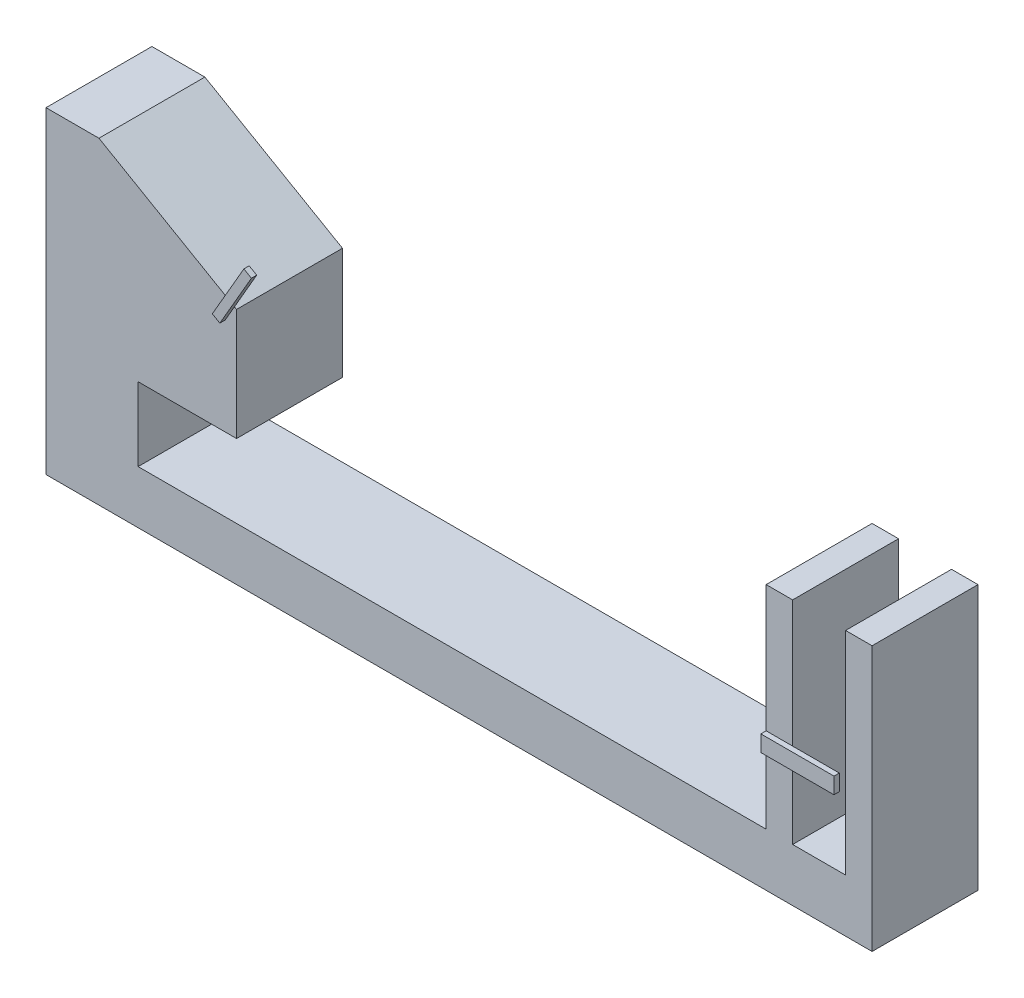
ISO-10303-21;
HEADER;
FILE_DESCRIPTION(('STEP AP214'),'2;1');
FILE_NAME('part.step','',(''),(''),'','','');
FILE_SCHEMA(('AUTOMOTIVE_DESIGN { 1 0 10303 214 1 1 1 1 }'));
ENDSEC;
DATA;
#1=APPLICATION_CONTEXT('core data for automotive mechanical design processes');
#2=APPLICATION_PROTOCOL_DEFINITION('international standard','automotive_design',2000,#1);
#3=PRODUCT_CONTEXT('',#1,'mechanical');
#4=PRODUCT('Part','Part','',(#3));
#5=PRODUCT_RELATED_PRODUCT_CATEGORY('part','',(#4));
#6=PRODUCT_DEFINITION_FORMATION('','',#4);
#7=PRODUCT_DEFINITION_CONTEXT('part definition',#1,'design');
#8=PRODUCT_DEFINITION('design','',#6,#7);
#9=PRODUCT_DEFINITION_SHAPE('','',#8);
#10=(LENGTH_UNIT() NAMED_UNIT(*) SI_UNIT(.MILLI.,.METRE.));
#11=(NAMED_UNIT(*) PLANE_ANGLE_UNIT() SI_UNIT($,.RADIAN.));
#12=(NAMED_UNIT(*) SI_UNIT($,.STERADIAN.) SOLID_ANGLE_UNIT());
#13=UNCERTAINTY_MEASURE_WITH_UNIT(LENGTH_MEASURE(1.E-05),#10,'distance_accuracy_value','');
#14=(GEOMETRIC_REPRESENTATION_CONTEXT(3) GLOBAL_UNCERTAINTY_ASSIGNED_CONTEXT((#13)) GLOBAL_UNIT_ASSIGNED_CONTEXT((#10,
#11,#12)) REPRESENTATION_CONTEXT('',''));
#15=CARTESIAN_POINT('',(0.,0.,0.));
#16=DIRECTION('',(0.,0.,1.));
#17=DIRECTION('',(1.,0.,0.));
#18=AXIS2_PLACEMENT_3D('',#15,#16,#17);
#19=CARTESIAN_POINT('',(398.292417795,421.108934872,210.));
#20=DIRECTION('',(0.,0.,-1.));
#21=DIRECTION('',(-1.,0.,0.));
#22=AXIS2_PLACEMENT_3D('',#19,#20,#21);
#23=PLANE('',#22);
#24=DIRECTION('',(0.499999999998696,0.866025403785191,0.));
#25=VECTOR('',#24,1.);
#26=CARTESIAN_POINT('',(368.0520260715,473.388674268,210.));
#27=LINE('',#26,#25);
#28=CARTESIAN_POINT('',(338.25421327566,421.777348554226,210.));
#29=VERTEX_POINT('',#28);
#30=CARTESIAN_POINT('',(397.849838848167,524.999999995477,210.));
#31=VERTEX_POINT('',#30);
#32=EDGE_CURVE('E215',#29,#31,#27,.T.);
#33=ORIENTED_EDGE('',*,*,#32,.T.);
#34=DIRECTION('',(-0.866025403781249,0.500000000005524,0.));
#35=VECTOR('',#34,1.);
#36=CARTESIAN_POINT('',(390.7660750775,529.089812936,210.));
#37=LINE('',#36,#35);
#38=CARTESIAN_POINT('',(383.68231127034,533.179625853774,210.));
#39=VERTEX_POINT('',#38);
#40=EDGE_CURVE('E201',#31,#39,#37,.T.);
#41=ORIENTED_EDGE('',*,*,#40,.T.);
#42=DIRECTION('',(-0.499999999998695,-0.866025403785192,0.));
#43=VECTOR('',#42,1.);
#44=CARTESIAN_POINT('',(353.8844984745,481.56830014,210.));
#45=LINE('',#44,#43);
#46=CARTESIAN_POINT('',(324.086685681165,429.956974426938,210.));
#47=VERTEX_POINT('',#46);
#48=EDGE_CURVE('E188',#39,#47,#45,.T.);
#49=ORIENTED_EDGE('',*,*,#48,.T.);
#50=DIRECTION('',(0.866025403781247,-0.500000000005529,0.));
#51=VECTOR('',#50,1.);
#52=CARTESIAN_POINT('',(331.1704494685,425.867161472,210.));
#53=LINE('',#52,#51);
#54=EDGE_CURVE('E207',#47,#29,#53,.T.);
#55=ORIENTED_EDGE('',*,*,#54,.T.);
#56=EDGE_LOOP('',(#33,#41,#49,#55));
#57=FACE_BOUND('',#56,.T.);
#58=ADVANCED_FACE('F15',(#57),#23,.F.);
#59=CARTESIAN_POINT('',(383.682311279,533.179625872,200.));
#60=DIRECTION('',(-0.500000000005524,-0.866025403781249,0.));
#61=DIRECTION('',(0.866025403781249,-0.500000000005524,0.));
#62=AXIS2_PLACEMENT_3D('',#59,#60,#61);
#63=PLANE('',#62);
#64=DIRECTION('',(0.,0.,1.));
#65=VECTOR('',#64,1.);
#66=CARTESIAN_POINT('',(383.682311279,533.179625872,205.));
#67=LINE('',#66,#65);
#68=CARTESIAN_POINT('',(383.682311277279,533.17962586902,200.));
#69=VERTEX_POINT('',#68);
#70=EDGE_CURVE('E180',#69,#39,#67,.T.);
#71=ORIENTED_EDGE('',*,*,#70,.T.);
#72=ORIENTED_EDGE('',*,*,#40,.F.);
#73=DIRECTION('',(0.,0.,-1.));
#74=VECTOR('',#73,1.);
#75=CARTESIAN_POINT('',(397.849838876,525.,205.));
#76=LINE('',#75,#74);
#77=CARTESIAN_POINT('',(397.849838867134,524.999999984644,200.));
#78=VERTEX_POINT('',#77);
#79=EDGE_CURVE('E196',#31,#78,#76,.T.);
#80=ORIENTED_EDGE('',*,*,#79,.T.);
#81=DIRECTION('',(0.866025402907682,-0.500000001518586,0.));
#82=VECTOR('',#81,1.);
#83=CARTESIAN_POINT('',(383.682311300281,533.179625851766,200.));
#84=LINE('',#83,#82);
#85=EDGE_CURVE('E19',#69,#78,#84,.T.);
#86=ORIENTED_EDGE('',*,*,#85,.F.);
#87=EDGE_LOOP('',(#71,#72,#80,#86));
#88=FACE_BOUND('',#87,.T.);
#89=ADVANCED_FACE('F194',(#88),#63,.F.);
#90=CARTESIAN_POINT('',(398.186763084,451.791822174,200.));
#91=DIRECTION('',(0.,0.,-1.));
#92=DIRECTION('',(-1.,0.,0.));
#93=AXIS2_PLACEMENT_3D('',#90,#91,#92);
#94=PLANE('',#93);
#95=DIRECTION('',(0.499999999998695,0.866025403785192,0.));
#96=VECTOR('',#95,1.);
#97=CARTESIAN_POINT('',(353.8844984745,481.56830014,200.));
#98=LINE('',#97,#96);
#99=CARTESIAN_POINT('',(341.695804201397,460.456862413202,200.));
#100=VERTEX_POINT('',#99);
#101=EDGE_CURVE('E185',#100,#69,#98,.T.);
#102=ORIENTED_EDGE('',*,*,#101,.T.);
#103=ORIENTED_EDGE('',*,*,#85,.T.);
#104=DIRECTION('',(-0.499999999998696,-0.866025403785191,0.));
#105=VECTOR('',#104,1.);
#106=CARTESIAN_POINT('',(368.0520260715,473.388674268,200.));
#107=LINE('',#106,#105);
#108=CARTESIAN_POINT('',(355.863331756745,452.277236497676,200.));
#109=VERTEX_POINT('',#108);
#110=EDGE_CURVE('E212',#78,#109,#107,.T.);
#111=ORIENTED_EDGE('',*,*,#110,.T.);
#112=DIRECTION('',(-0.866025403784162,0.500000000000478,0.));
#113=VECTOR('',#112,1.);
#114=CARTESIAN_POINT('',(229.9038105675,525.,200.));
#115=LINE('',#114,#113);
#116=EDGE_CURVE('E203',#109,#100,#115,.T.);
#117=ORIENTED_EDGE('',*,*,#116,.T.);
#118=EDGE_LOOP('',(#102,#103,#111,#117));
#119=FACE_BOUND('',#118,.T.);
#120=ADVANCED_FACE('F202',(#119),#94,.T.);
#121=CARTESIAN_POINT('',(1359.807621135,500.,200.));
#122=DIRECTION('',(0.,-1.,0.));
#123=DIRECTION('',(0.,0.,-1.));
#124=AXIS2_PLACEMENT_3D('',#121,#122,#123);
#125=PLANE('',#124);
#126=DIRECTION('',(0.,0.,1.));
#127=VECTOR('',#126,1.);
#128=CARTESIAN_POINT('',(1359.807621135,500.,105.));
#129=LINE('',#128,#127);
#130=CARTESIAN_POINT('',(1359.80762128473,499.99999995,0.));
#131=VERTEX_POINT('',#130);
#132=CARTESIAN_POINT('',(1359.807621135,500.,199.99999998));
#133=VERTEX_POINT('',#132);
#134=EDGE_CURVE('E628',#131,#133,#129,.T.);
#135=ORIENTED_EDGE('',*,*,#134,.T.);
#136=DIRECTION('',(1.,0.,0.));
#137=VECTOR('',#136,1.);
#138=CARTESIAN_POINT('',(1384.807621135,500.,200.));
#139=LINE('',#138,#137);
#140=CARTESIAN_POINT('',(1409.807621135,500.,200.));
#141=VERTEX_POINT('',#140);
#142=EDGE_CURVE('E200',#133,#141,#139,.T.);
#143=ORIENTED_EDGE('',*,*,#142,.T.);
#144=DIRECTION('',(0.,0.,-1.));
#145=VECTOR('',#144,1.);
#146=CARTESIAN_POINT('',(1409.807621135,500.,100.));
#147=LINE('',#146,#145);
#148=CARTESIAN_POINT('',(1409.8076212473,499.99999995,0.));
#149=VERTEX_POINT('',#148);
#150=EDGE_CURVE('E300',#141,#149,#147,.T.);
#151=ORIENTED_EDGE('',*,*,#150,.T.);
#152=DIRECTION('',(1.,0.,0.));
#153=VECTOR('',#152,1.);
#154=CARTESIAN_POINT('',(779.9038105675,499.9999998,0.));
#155=LINE('',#154,#153);
#156=EDGE_CURVE('E322',#131,#149,#155,.T.);
#157=ORIENTED_EDGE('',*,*,#156,.F.);
#158=EDGE_LOOP('',(#135,#143,#151,#157));
#159=FACE_BOUND('',#158,.T.);
#160=ADVANCED_FACE('F575',(#159),#125,.F.);
#161=CARTESIAN_POINT('',(1409.807621135,260.861099919,200.));
#162=DIRECTION('',(0.,0.,-1.));
#163=DIRECTION('',(-1.,0.,0.));
#164=AXIS2_PLACEMENT_3D('',#161,#162,#163);
#165=PLANE('',#164);
#166=DIRECTION('',(0.,1.,0.));
#167=VECTOR('',#166,1.);
#168=CARTESIAN_POINT('',(1409.807621135,300.,200.));
#169=LINE('',#168,#167);
#170=CARTESIAN_POINT('',(1409.80762116633,260.861099929125,200.));
#171=VERTEX_POINT('',#170);
#172=EDGE_CURVE('E303',#171,#141,#169,.T.);
#173=ORIENTED_EDGE('',*,*,#172,.T.);
#174=ORIENTED_EDGE('',*,*,#142,.F.);
#175=DIRECTION('',(0.,-1.,0.));
#176=VECTOR('',#175,1.);
#177=CARTESIAN_POINT('',(1359.807621135,300.,199.99999992));
#178=LINE('',#177,#176);
#179=CARTESIAN_POINT('',(1359.807621135,260.86109993925,199.99999998));
#180=VERTEX_POINT('',#179);
#181=EDGE_CURVE('E633',#133,#180,#178,.T.);
#182=ORIENTED_EDGE('',*,*,#181,.T.);
#183=DIRECTION('',(1.,0.,0.));
#184=VECTOR('',#183,1.);
#185=CARTESIAN_POINT('',(1428.816745757,260.861099919,200.));
#186=LINE('',#185,#184);
#187=EDGE_CURVE('E324',#180,#171,#186,.T.);
#188=ORIENTED_EDGE('',*,*,#187,.T.);
#189=EDGE_LOOP('',(#173,#174,#182,#188));
#190=FACE_BOUND('',#189,.T.);
#191=ADVANCED_FACE('F566',(#190),#165,.F.);
#192=CARTESIAN_POINT('',(1359.807621135,260.861099919,210.));
#193=DIRECTION('',(0.,-1.,0.));
#194=DIRECTION('',(0.,0.,-1.));
#195=AXIS2_PLACEMENT_3D('',#192,#193,#194);
#196=PLANE('',#195);
#197=ORIENTED_EDGE('',*,*,#187,.F.);
#198=DIRECTION('',(0.,0.,1.));
#199=VECTOR('',#198,1.);
#200=CARTESIAN_POINT('',(1359.807621135,260.8611,105.));
#201=LINE('',#200,#199);
#202=CARTESIAN_POINT('',(1359.807621135,260.86109993925,210.));
#203=VERTEX_POINT('',#202);
#204=EDGE_CURVE('E637',#180,#203,#201,.T.);
#205=ORIENTED_EDGE('',*,*,#204,.T.);
#206=DIRECTION('',(-1.,0.,0.));
#207=VECTOR('',#206,1.);
#208=CARTESIAN_POINT('',(1428.816745757,260.861099919,210.));
#209=LINE('',#208,#207);
#210=CARTESIAN_POINT('',(1497.825870379,260.861099919,210.));
#211=VERTEX_POINT('',#210);
#212=EDGE_CURVE('E320',#211,#203,#209,.T.);
#213=ORIENTED_EDGE('',*,*,#212,.F.);
#214=DIRECTION('',(0.,0.,-1.));
#215=VECTOR('',#214,1.);
#216=CARTESIAN_POINT('',(1497.825870379,260.861099919,205.));
#217=LINE('',#216,#215);
#218=CARTESIAN_POINT('',(1497.825870379,260.861099919,200.));
#219=VERTEX_POINT('',#218);
#220=EDGE_CURVE('E315',#211,#219,#217,.T.);
#221=ORIENTED_EDGE('',*,*,#220,.T.);
#222=DIRECTION('',(-1.,0.,0.));
#223=VECTOR('',#222,1.);
#224=CARTESIAN_POINT('',(1453.816745757,260.861099919,200.));
#225=LINE('',#224,#223);
#226=EDGE_CURVE('E309',#219,#171,#225,.T.);
#227=ORIENTED_EDGE('',*,*,#226,.T.);
#228=EDGE_LOOP('',(#197,#205,#213,#221,#227));
#229=FACE_BOUND('',#228,.T.);
#230=ADVANCED_FACE('F558',(#229),#196,.F.);
#231=CARTESIAN_POINT('',(1559.807621135,0.,0.));
#232=DIRECTION('',(0.,0.,-1.));
#233=DIRECTION('',(-1.,0.,0.));
#234=AXIS2_PLACEMENT_3D('',#231,#232,#233);
#235=PLANE('',#234);
#236=DIRECTION('',(0.,-1.,0.));
#237=VECTOR('',#236,1.);
#238=CARTESIAN_POINT('',(359.807621135,344.406784259,0.));
#239=LINE('',#238,#237);
#240=CARTESIAN_POINT('',(359.807621253456,450.,0.));
#241=VERTEX_POINT('',#240);
#242=CARTESIAN_POINT('',(359.807621253456,238.8135684885,0.));
#243=VERTEX_POINT('',#242);
#244=EDGE_CURVE('E221',#241,#243,#239,.T.);
#245=ORIENTED_EDGE('',*,*,#244,.T.);
#246=DIRECTION('',(-1.,0.,0.));
#247=VECTOR('',#246,1.);
#248=CARTESIAN_POINT('',(266.8817194405,238.813568518,0.));
#249=LINE('',#248,#247);
#250=CARTESIAN_POINT('',(173.955817869511,238.8135684885,0.));
#251=VERTEX_POINT('',#250);
#252=EDGE_CURVE('E344',#243,#251,#249,.T.);
#253=ORIENTED_EDGE('',*,*,#252,.T.);
#254=DIRECTION('',(0.,-1.,0.));
#255=VECTOR('',#254,1.);
#256=CARTESIAN_POINT('',(173.955817746,169.406784259,0.));
#257=LINE('',#256,#255);
#258=CARTESIAN_POINT('',(173.955817869511,100.00000005,0.));
#259=VERTEX_POINT('',#258);
#260=EDGE_CURVE('E645',#251,#259,#257,.T.);
#261=ORIENTED_EDGE('',*,*,#260,.T.);
#262=DIRECTION('',(1.,0.,0.));
#263=VECTOR('',#262,1.);
#264=CARTESIAN_POINT('',(766.8817194405,100.,0.));
#265=LINE('',#264,#263);
#266=CARTESIAN_POINT('',(1359.80762128473,100.00000005,0.));
#267=VERTEX_POINT('',#266);
#268=EDGE_CURVE('E634',#259,#267,#265,.T.);
#269=ORIENTED_EDGE('',*,*,#268,.T.);
#270=DIRECTION('',(0.,1.,0.));
#271=VECTOR('',#270,1.);
#272=CARTESIAN_POINT('',(1359.807621135,300.,0.));
#273=LINE('',#272,#271);
#274=EDGE_CURVE('E689',#267,#131,#273,.T.);
#275=ORIENTED_EDGE('',*,*,#274,.T.);
#276=ORIENTED_EDGE('',*,*,#156,.T.);
#277=DIRECTION('',(0.,-1.,0.));
#278=VECTOR('',#277,1.);
#279=CARTESIAN_POINT('',(1409.807621135,300.,0.));
#280=LINE('',#279,#278);
#281=CARTESIAN_POINT('',(1409.8076212473,100.00000005,0.));
#282=VERTEX_POINT('',#281);
#283=EDGE_CURVE('E298',#149,#282,#280,.T.);
#284=ORIENTED_EDGE('',*,*,#283,.T.);
#285=DIRECTION('',(1.,0.,0.));
#286=VECTOR('',#285,1.);
#287=CARTESIAN_POINT('',(1459.807621135,100.,0.));
#288=LINE('',#287,#286);
#289=CARTESIAN_POINT('',(1509.80762117243,100.00000005,0.));
#290=VERTEX_POINT('',#289);
#291=EDGE_CURVE('E293',#282,#290,#288,.T.);
#292=ORIENTED_EDGE('',*,*,#291,.T.);
#293=DIRECTION('',(0.,1.,0.));
#294=VECTOR('',#293,1.);
#295=CARTESIAN_POINT('',(1509.807621135,300.,0.));
#296=LINE('',#295,#294);
#297=CARTESIAN_POINT('',(1509.80762117243,499.99999995,0.));
#298=VERTEX_POINT('',#297);
#299=EDGE_CURVE('E288',#290,#298,#296,.T.);
#300=ORIENTED_EDGE('',*,*,#299,.T.);
#301=DIRECTION('',(1.,0.,0.));
#302=VECTOR('',#301,1.);
#303=CARTESIAN_POINT('',(1534.807621135,500.,0.));
#304=LINE('',#303,#302);
#305=CARTESIAN_POINT('',(1559.807621135,499.99999995,0.));
#306=VERTEX_POINT('',#305);
#307=EDGE_CURVE('E283',#298,#306,#304,.T.);
#308=ORIENTED_EDGE('',*,*,#307,.T.);
#309=DIRECTION('',(0.,-1.,0.));
#310=VECTOR('',#309,1.);
#311=CARTESIAN_POINT('',(1559.807621135,250.,0.));
#312=LINE('',#311,#310);
#313=CARTESIAN_POINT('',(1559.807621135,0.,0.));
#314=VERTEX_POINT('',#313);
#315=EDGE_CURVE('E278',#306,#314,#312,.T.);
#316=ORIENTED_EDGE('',*,*,#315,.T.);
#317=DIRECTION('',(-1.,0.,0.));
#318=VECTOR('',#317,1.);
#319=CARTESIAN_POINT('',(779.9038105675,0.,0.));
#320=LINE('',#319,#318);
#321=CARTESIAN_POINT('',(0.,0.,0.));
#322=VERTEX_POINT('',#321);
#323=EDGE_CURVE('E273',#314,#322,#320,.T.);
#324=ORIENTED_EDGE('',*,*,#323,.T.);
#325=DIRECTION('',(0.,1.,0.));
#326=VECTOR('',#325,1.);
#327=CARTESIAN_POINT('',(0.,300.,0.));
#328=LINE('',#327,#326);
#329=CARTESIAN_POINT('',(0.,600.,0.));
#330=VERTEX_POINT('',#329);
#331=EDGE_CURVE('E265',#322,#330,#328,.T.);
#332=ORIENTED_EDGE('',*,*,#331,.T.);
#333=DIRECTION('',(1.,0.,0.));
#334=VECTOR('',#333,1.);
#335=CARTESIAN_POINT('',(50.,600.,0.));
#336=LINE('',#335,#334);
#337=CARTESIAN_POINT('',(99.9999999251367,600.,0.));
#338=VERTEX_POINT('',#337);
#339=EDGE_CURVE('E190',#330,#338,#336,.T.);
#340=ORIENTED_EDGE('',*,*,#339,.T.);
#341=DIRECTION('',(0.866025403784162,-0.500000000000478,0.));
#342=VECTOR('',#341,1.);
#343=CARTESIAN_POINT('',(229.9038105675,525.,0.));
#344=LINE('',#343,#342);
#345=EDGE_CURVE('E222',#338,#241,#344,.T.);
#346=ORIENTED_EDGE('',*,*,#345,.T.);
#347=EDGE_LOOP('',(#245,#253,#261,#269,#275,#276,#284,#292,#300,#308,#316,#324,#332,#340,#346));
#348=FACE_BOUND('',#347,.T.);
#349=ADVANCED_FACE('F549',(#348),#235,.T.);
#350=CARTESIAN_POINT('',(1359.807621135,230.32880894,210.));
#351=DIRECTION('',(0.,0.,1.));
#352=DIRECTION('',(1.,0.,0.));
#353=AXIS2_PLACEMENT_3D('',#350,#351,#352);
#354=PLANE('',#353);
#355=DIRECTION('',(0.,1.,0.));
#356=VECTOR('',#355,1.);
#357=CARTESIAN_POINT('',(1497.825870379,245.5949544295,210.));
#358=LINE('',#357,#356);
#359=CARTESIAN_POINT('',(1497.825870379,230.32880894,210.));
#360=VERTEX_POINT('',#359);
#361=EDGE_CURVE('E317',#360,#211,#358,.T.);
#362=ORIENTED_EDGE('',*,*,#361,.T.);
#363=ORIENTED_EDGE('',*,*,#212,.T.);
#364=DIRECTION('',(0.,-1.,0.));
#365=VECTOR('',#364,1.);
#366=CARTESIAN_POINT('',(1359.807621135,300.,210.));
#367=LINE('',#366,#365);
#368=CARTESIAN_POINT('',(1359.807621135,230.32880887,210.));
#369=VERTEX_POINT('',#368);
#370=EDGE_CURVE('E694',#203,#369,#367,.T.);
#371=ORIENTED_EDGE('',*,*,#370,.T.);
#372=DIRECTION('',(1.,0.,0.));
#373=VECTOR('',#372,1.);
#374=CARTESIAN_POINT('',(1428.816745757,230.32880894,210.));
#375=LINE('',#374,#373);
#376=EDGE_CURVE('E685',#369,#360,#375,.T.);
#377=ORIENTED_EDGE('',*,*,#376,.T.);
#378=EDGE_LOOP('',(#362,#363,#371,#377));
#379=FACE_BOUND('',#378,.T.);
#380=ADVANCED_FACE('F540',(#379),#354,.T.);
#381=CARTESIAN_POINT('',(1497.825870379,230.32880894,200.));
#382=DIRECTION('',(-1.,0.,0.));
#383=DIRECTION('',(0.,0.,1.));
#384=AXIS2_PLACEMENT_3D('',#381,#382,#383);
#385=PLANE('',#384);
#386=ORIENTED_EDGE('',*,*,#220,.F.);
#387=ORIENTED_EDGE('',*,*,#361,.F.);
#388=DIRECTION('',(0.,0.,-1.));
#389=VECTOR('',#388,1.);
#390=CARTESIAN_POINT('',(1497.825870379,230.32880894,205.));
#391=LINE('',#390,#389);
#392=CARTESIAN_POINT('',(1497.825870379,230.32880894,200.));
#393=VERTEX_POINT('',#392);
#394=EDGE_CURVE('E682',#360,#393,#391,.T.);
#395=ORIENTED_EDGE('',*,*,#394,.T.);
#396=DIRECTION('',(0.,1.,0.));
#397=VECTOR('',#396,1.);
#398=CARTESIAN_POINT('',(1497.825870379,245.5949544295,200.));
#399=LINE('',#398,#397);
#400=EDGE_CURVE('E312',#393,#219,#399,.T.);
#401=ORIENTED_EDGE('',*,*,#400,.T.);
#402=EDGE_LOOP('',(#386,#387,#395,#401));
#403=FACE_BOUND('',#402,.T.);
#404=ADVANCED_FACE('F531',(#403),#385,.F.);
#405=CARTESIAN_POINT('',(1409.807621135,230.32880894,200.));
#406=DIRECTION('',(0.,0.,1.));
#407=DIRECTION('',(1.,0.,0.));
#408=AXIS2_PLACEMENT_3D('',#405,#406,#407);
#409=PLANE('',#408);
#410=DIRECTION('',(0.,1.,0.));
#411=VECTOR('',#410,1.);
#412=CARTESIAN_POINT('',(1409.807621135,300.,200.));
#413=LINE('',#412,#411);
#414=CARTESIAN_POINT('',(1409.80762119898,230.3288088875,200.));
#415=VERTEX_POINT('',#414);
#416=EDGE_CURVE('E306',#415,#171,#413,.T.);
#417=ORIENTED_EDGE('',*,*,#416,.T.);
#418=ORIENTED_EDGE('',*,*,#226,.F.);
#419=ORIENTED_EDGE('',*,*,#400,.F.);
#420=DIRECTION('',(-1.,0.,0.));
#421=VECTOR('',#420,1.);
#422=CARTESIAN_POINT('',(1428.816745757,230.32880894,200.));
#423=LINE('',#422,#421);
#424=EDGE_CURVE('E679',#393,#415,#423,.T.);
#425=ORIENTED_EDGE('',*,*,#424,.T.);
#426=EDGE_LOOP('',(#417,#418,#419,#425));
#427=FACE_BOUND('',#426,.T.);
#428=ADVANCED_FACE('F522',(#427),#409,.F.);
#429=CARTESIAN_POINT('',(1409.807621135,500.,0.));
#430=DIRECTION('',(-1.,0.,0.));
#431=DIRECTION('',(0.,-1.,0.));
#432=AXIS2_PLACEMENT_3D('',#429,#430,#431);
#433=PLANE('',#432);
#434=ORIENTED_EDGE('',*,*,#150,.F.);
#435=ORIENTED_EDGE('',*,*,#172,.F.);
#436=ORIENTED_EDGE('',*,*,#416,.F.);
#437=DIRECTION('',(0.,-1.,0.));
#438=VECTOR('',#437,1.);
#439=CARTESIAN_POINT('',(1409.80762158418,300.,200.));
#440=LINE('',#439,#438);
#441=CARTESIAN_POINT('',(1409.8076212473,100.00000005,200.));
#442=VERTEX_POINT('',#441);
#443=EDGE_CURVE('E676',#415,#442,#440,.T.);
#444=ORIENTED_EDGE('',*,*,#443,.T.);
#445=DIRECTION('',(0.,0.,-1.));
#446=VECTOR('',#445,1.);
#447=CARTESIAN_POINT('',(1409.807621135,100.,100.));
#448=LINE('',#447,#446);
#449=EDGE_CURVE('E295',#442,#282,#448,.T.);
#450=ORIENTED_EDGE('',*,*,#449,.T.);
#451=ORIENTED_EDGE('',*,*,#283,.F.);
#452=EDGE_LOOP('',(#434,#435,#436,#444,#450,#451));
#453=FACE_BOUND('',#452,.T.);
#454=ADVANCED_FACE('F513',(#453),#433,.F.);
#455=CARTESIAN_POINT('',(1409.807621135,100.,0.));
#456=DIRECTION('',(0.,-1.,0.));
#457=DIRECTION('',(1.,0.,0.));
#458=AXIS2_PLACEMENT_3D('',#455,#456,#457);
#459=PLANE('',#458);
#460=ORIENTED_EDGE('',*,*,#449,.F.);
#461=DIRECTION('',(1.,0.,0.));
#462=VECTOR('',#461,1.);
#463=CARTESIAN_POINT('',(779.9038105675,100.0000002,200.));
#464=LINE('',#463,#462);
#465=CARTESIAN_POINT('',(1509.80762117243,100.00000005,200.));
#466=VERTEX_POINT('',#465);
#467=EDGE_CURVE('E673',#442,#466,#464,.T.);
#468=ORIENTED_EDGE('',*,*,#467,.T.);
#469=DIRECTION('',(0.,0.,-1.));
#470=VECTOR('',#469,1.);
#471=CARTESIAN_POINT('',(1509.807621135,100.,100.));
#472=LINE('',#471,#470);
#473=EDGE_CURVE('E290',#466,#290,#472,.T.);
#474=ORIENTED_EDGE('',*,*,#473,.T.);
#475=ORIENTED_EDGE('',*,*,#291,.F.);
#476=EDGE_LOOP('',(#460,#468,#474,#475));
#477=FACE_BOUND('',#476,.T.);
#478=ADVANCED_FACE('F504',(#477),#459,.F.);
#479=CARTESIAN_POINT('',(1509.807621135,100.,0.));
#480=DIRECTION('',(1.,0.,0.));
#481=DIRECTION('',(0.,1.,0.));
#482=AXIS2_PLACEMENT_3D('',#479,#480,#481);
#483=PLANE('',#482);
#484=ORIENTED_EDGE('',*,*,#473,.F.);
#485=DIRECTION('',(0.,1.,0.));
#486=VECTOR('',#485,1.);
#487=CARTESIAN_POINT('',(1509.80762128473,300.,200.));
#488=LINE('',#487,#486);
#489=CARTESIAN_POINT('',(1509.80762117243,499.99999995,200.));
#490=VERTEX_POINT('',#489);
#491=EDGE_CURVE('E670',#466,#490,#488,.T.);
#492=ORIENTED_EDGE('',*,*,#491,.T.);
#493=DIRECTION('',(0.,0.,-1.));
#494=VECTOR('',#493,1.);
#495=CARTESIAN_POINT('',(1509.807621135,500.,100.));
#496=LINE('',#495,#494);
#497=EDGE_CURVE('E285',#490,#298,#496,.T.);
#498=ORIENTED_EDGE('',*,*,#497,.T.);
#499=ORIENTED_EDGE('',*,*,#299,.F.);
#500=EDGE_LOOP('',(#484,#492,#498,#499));
#501=FACE_BOUND('',#500,.T.);
#502=ADVANCED_FACE('F495',(#501),#483,.F.);
#503=CARTESIAN_POINT('',(1509.807621135,500.,200.));
#504=DIRECTION('',(0.,-1.,0.));
#505=DIRECTION('',(0.,0.,-1.));
#506=AXIS2_PLACEMENT_3D('',#503,#504,#505);
#507=PLANE('',#506);
#508=ORIENTED_EDGE('',*,*,#497,.F.);
#509=DIRECTION('',(1.,0.,0.));
#510=VECTOR('',#509,1.);
#511=CARTESIAN_POINT('',(779.9038105675,499.9999998,200.));
#512=LINE('',#511,#510);
#513=CARTESIAN_POINT('',(1559.807621135,499.99999995,200.));
#514=VERTEX_POINT('',#513);
#515=EDGE_CURVE('E667',#490,#514,#512,.T.);
#516=ORIENTED_EDGE('',*,*,#515,.T.);
#517=DIRECTION('',(0.,0.,-1.));
#518=VECTOR('',#517,1.);
#519=CARTESIAN_POINT('',(1559.807621135,500.,100.));
#520=LINE('',#519,#518);
#521=EDGE_CURVE('E280',#514,#306,#520,.T.);
#522=ORIENTED_EDGE('',*,*,#521,.T.);
#523=ORIENTED_EDGE('',*,*,#307,.F.);
#524=EDGE_LOOP('',(#508,#516,#522,#523));
#525=FACE_BOUND('',#524,.T.);
#526=ADVANCED_FACE('F486',(#525),#507,.F.);
#527=CARTESIAN_POINT('',(1559.807621135,500.,0.));
#528=DIRECTION('',(-1.,0.,0.));
#529=DIRECTION('',(0.,-1.,0.));
#530=AXIS2_PLACEMENT_3D('',#527,#528,#529);
#531=PLANE('',#530);
#532=ORIENTED_EDGE('',*,*,#521,.F.);
#533=DIRECTION('',(0.,-1.,0.));
#534=VECTOR('',#533,1.);
#535=CARTESIAN_POINT('',(1559.807621135,300.,200.));
#536=LINE('',#535,#534);
#537=CARTESIAN_POINT('',(1559.807621135,0.,200.));
#538=VERTEX_POINT('',#537);
#539=EDGE_CURVE('E664',#514,#538,#536,.T.);
#540=ORIENTED_EDGE('',*,*,#539,.T.);
#541=DIRECTION('',(0.,0.,-1.));
#542=VECTOR('',#541,1.);
#543=CARTESIAN_POINT('',(1559.807621135,0.,100.));
#544=LINE('',#543,#542);
#545=EDGE_CURVE('E275',#538,#314,#544,.T.);
#546=ORIENTED_EDGE('',*,*,#545,.T.);
#547=ORIENTED_EDGE('',*,*,#315,.F.);
#548=EDGE_LOOP('',(#532,#540,#546,#547));
#549=FACE_BOUND('',#548,.T.);
#550=ADVANCED_FACE('F477',(#549),#531,.F.);
#551=CARTESIAN_POINT('',(0.,0.,0.));
#552=DIRECTION('',(0.,1.,0.));
#553=DIRECTION('',(0.,0.,1.));
#554=AXIS2_PLACEMENT_3D('',#551,#552,#553);
#555=PLANE('',#554);
#556=ORIENTED_EDGE('',*,*,#545,.F.);
#557=DIRECTION('',(-1.,0.,0.));
#558=VECTOR('',#557,1.);
#559=CARTESIAN_POINT('',(779.9038105675,0.,200.));
#560=LINE('',#559,#558);
#561=CARTESIAN_POINT('',(0.,0.,200.));
#562=VERTEX_POINT('',#561);
#563=EDGE_CURVE('E661',#538,#562,#560,.T.);
#564=ORIENTED_EDGE('',*,*,#563,.T.);
#565=DIRECTION('',(0.,0.,-1.));
#566=VECTOR('',#565,1.);
#567=CARTESIAN_POINT('',(0.,0.,100.));
#568=LINE('',#567,#566);
#569=EDGE_CURVE('E268',#562,#322,#568,.T.);
#570=ORIENTED_EDGE('',*,*,#569,.T.);
#571=ORIENTED_EDGE('',*,*,#323,.F.);
#572=EDGE_LOOP('',(#556,#564,#570,#571));
#573=FACE_BOUND('',#572,.T.);
#574=ADVANCED_FACE('F469',(#573),#555,.F.);
#575=CARTESIAN_POINT('',(0.,0.,200.));
#576=DIRECTION('',(1.,0.,0.));
#577=DIRECTION('',(0.,0.,-1.));
#578=AXIS2_PLACEMENT_3D('',#575,#576,#577);
#579=PLANE('',#578);
#580=ORIENTED_EDGE('',*,*,#569,.F.);
#581=DIRECTION('',(0.,1.,0.));
#582=VECTOR('',#581,1.);
#583=CARTESIAN_POINT('',(0.,300.,200.));
#584=LINE('',#583,#582);
#585=CARTESIAN_POINT('',(0.,600.,200.));
#586=VERTEX_POINT('',#585);
#587=EDGE_CURVE('E237',#562,#586,#584,.T.);
#588=ORIENTED_EDGE('',*,*,#587,.T.);
#589=DIRECTION('',(0.,0.,-1.));
#590=VECTOR('',#589,1.);
#591=CARTESIAN_POINT('',(0.,600.,100.));
#592=LINE('',#591,#590);
#593=EDGE_CURVE('E262',#586,#330,#592,.T.);
#594=ORIENTED_EDGE('',*,*,#593,.T.);
#595=ORIENTED_EDGE('',*,*,#331,.F.);
#596=EDGE_LOOP('',(#580,#588,#594,#595));
#597=FACE_BOUND('',#596,.T.);
#598=ADVANCED_FACE('F461',(#597),#579,.F.);
#599=CARTESIAN_POINT('',(0.,600.,200.));
#600=DIRECTION('',(0.,-1.,0.));
#601=DIRECTION('',(0.,0.,-1.));
#602=AXIS2_PLACEMENT_3D('',#599,#600,#601);
#603=PLANE('',#602);
#604=ORIENTED_EDGE('',*,*,#593,.F.);
#605=DIRECTION('',(1.,0.,0.));
#606=VECTOR('',#605,1.);
#607=CARTESIAN_POINT('',(779.9038105675,600.,200.));
#608=LINE('',#607,#606);
#609=CARTESIAN_POINT('',(100.,600.,200.));
#610=VERTEX_POINT('',#609);
#611=EDGE_CURVE('E233',#586,#610,#608,.T.);
#612=ORIENTED_EDGE('',*,*,#611,.T.);
#613=DIRECTION('',(0.,0.,-1.));
#614=VECTOR('',#613,1.);
#615=CARTESIAN_POINT('',(100.,600.,100.));
#616=LINE('',#615,#614);
#617=EDGE_CURVE('E217',#610,#338,#616,.T.);
#618=ORIENTED_EDGE('',*,*,#617,.T.);
#619=ORIENTED_EDGE('',*,*,#339,.F.);
#620=EDGE_LOOP('',(#604,#612,#618,#619));
#621=FACE_BOUND('',#620,.T.);
#622=ADVANCED_FACE('F259',(#621),#603,.F.);
#623=CARTESIAN_POINT('',(324.08668567,429.956974408,200.));
#624=DIRECTION('',(0.866025403785192,-0.499999999998695,0.));
#625=DIRECTION('',(0.499999999998695,0.866025403785192,0.));
#626=AXIS2_PLACEMENT_3D('',#623,#624,#625);
#627=PLANE('',#626);
#628=DIRECTION('',(-0.499999999998695,-0.866025403785192,0.));
#629=VECTOR('',#628,1.);
#630=CARTESIAN_POINT('',(446.840088349149,642.572104650988,200.));
#631=LINE('',#630,#629);
#632=CARTESIAN_POINT('',(324.08668567,429.956974408,200.));
#633=VERTEX_POINT('',#632);
#634=EDGE_CURVE('E246',#100,#633,#631,.T.);
#635=ORIENTED_EDGE('',*,*,#634,.T.);
#636=DIRECTION('',(0.,0.,1.));
#637=VECTOR('',#636,1.);
#638=CARTESIAN_POINT('',(324.08668567,429.956974408,205.));
#639=LINE('',#638,#637);
#640=EDGE_CURVE('E205',#633,#47,#639,.T.);
#641=ORIENTED_EDGE('',*,*,#640,.T.);
#642=ORIENTED_EDGE('',*,*,#48,.F.);
#643=ORIENTED_EDGE('',*,*,#70,.F.);
#644=ORIENTED_EDGE('',*,*,#101,.F.);
#645=EDGE_LOOP('',(#635,#641,#642,#643,#644));
#646=FACE_BOUND('',#645,.T.);
#647=ADVANCED_FACE('F183',(#646),#627,.F.);
#648=CARTESIAN_POINT('',(338.254213267,421.777348536,200.));
#649=DIRECTION('',(0.500000000005529,0.866025403781247,0.));
#650=DIRECTION('',(-0.866025403781247,0.500000000005529,0.));
#651=AXIS2_PLACEMENT_3D('',#648,#649,#650);
#652=PLANE('',#651);
#653=DIRECTION('',(0.,0.,1.));
#654=VECTOR('',#653,1.);
#655=CARTESIAN_POINT('',(338.254213267,421.777348536,205.));
#656=LINE('',#655,#654);
#657=CARTESIAN_POINT('',(338.254213267,421.777348536,200.));
#658=VERTEX_POINT('',#657);
#659=EDGE_CURVE('E228',#658,#29,#656,.T.);
#660=ORIENTED_EDGE('',*,*,#659,.T.);
#661=ORIENTED_EDGE('',*,*,#54,.F.);
#662=ORIENTED_EDGE('',*,*,#640,.F.);
#663=DIRECTION('',(-0.866025403781247,0.500000000005529,0.));
#664=VECTOR('',#663,1.);
#665=CARTESIAN_POINT('',(338.254213267,421.777348536,200.));
#666=LINE('',#665,#664);
#667=EDGE_CURVE('E243',#633,#658,#666,.F.);
#668=ORIENTED_EDGE('',*,*,#667,.T.);
#669=EDGE_LOOP('',(#660,#661,#662,#668));
#670=FACE_BOUND('',#669,.T.);
#671=ADVANCED_FACE('F351',(#670),#652,.F.);
#672=CARTESIAN_POINT('',(397.849838876,525.,200.));
#673=DIRECTION('',(-0.866025403785191,0.499999999998696,0.));
#674=DIRECTION('',(-0.499999999998696,-0.866025403785191,0.));
#675=AXIS2_PLACEMENT_3D('',#672,#673,#674);
#676=PLANE('',#675);
#677=ORIENTED_EDGE('',*,*,#110,.F.);
#678=ORIENTED_EDGE('',*,*,#79,.F.);
#679=ORIENTED_EDGE('',*,*,#32,.F.);
#680=ORIENTED_EDGE('',*,*,#659,.F.);
#681=DIRECTION('',(-0.499999999998696,-0.866025403785191,0.));
#682=VECTOR('',#681,1.);
#683=CARTESIAN_POINT('',(397.849838876,525.,200.));
#684=LINE('',#683,#682);
#685=EDGE_CURVE('E240',#658,#109,#684,.F.);
#686=ORIENTED_EDGE('',*,*,#685,.T.);
#687=EDGE_LOOP('',(#677,#678,#679,#680,#686));
#688=FACE_BOUND('',#687,.T.);
#689=ADVANCED_FACE('F331',(#688),#676,.F.);
#690=CARTESIAN_POINT('',(100.,600.,0.));
#691=DIRECTION('',(-0.500000000000478,-0.866025403784162,0.));
#692=DIRECTION('',(0.866025403784162,-0.500000000000478,0.));
#693=AXIS2_PLACEMENT_3D('',#690,#691,#692);
#694=PLANE('',#693);
#695=ORIENTED_EDGE('',*,*,#617,.F.);
#696=DIRECTION('',(0.866025403784162,-0.500000000000478,0.));
#697=VECTOR('',#696,1.);
#698=CARTESIAN_POINT('',(100.,600.,200.));
#699=LINE('',#698,#697);
#700=EDGE_CURVE('E236',#610,#100,#699,.T.);
#701=ORIENTED_EDGE('',*,*,#700,.T.);
#702=ORIENTED_EDGE('',*,*,#116,.F.);
#703=DIRECTION('',(0.866025403784162,-0.500000000000478,0.));
#704=VECTOR('',#703,1.);
#705=CARTESIAN_POINT('',(100.,600.,200.));
#706=LINE('',#705,#704);
#707=CARTESIAN_POINT('',(359.807621371912,449.999999863219,200.));
#708=VERTEX_POINT('',#707);
#709=EDGE_CURVE('E227',#109,#708,#706,.T.);
#710=ORIENTED_EDGE('',*,*,#709,.T.);
#711=DIRECTION('',(0.,0.,-1.));
#712=VECTOR('',#711,1.);
#713=CARTESIAN_POINT('',(359.807621135,450.,100.));
#714=LINE('',#713,#712);
#715=EDGE_CURVE('E218',#708,#241,#714,.T.);
#716=ORIENTED_EDGE('',*,*,#715,.T.);
#717=ORIENTED_EDGE('',*,*,#345,.F.);
#718=EDGE_LOOP('',(#695,#701,#702,#710,#716,#717));
#719=FACE_BOUND('',#718,.T.);
#720=ADVANCED_FACE('F250',(#719),#694,.F.);
#721=CARTESIAN_POINT('',(359.807621135,450.,0.));
#722=DIRECTION('',(-1.,0.,0.));
#723=DIRECTION('',(0.,-1.,0.));
#724=AXIS2_PLACEMENT_3D('',#721,#722,#723);
#725=PLANE('',#724);
#726=DIRECTION('',(0.,0.,-1.));
#727=VECTOR('',#726,1.);
#728=CARTESIAN_POINT('',(359.807621135,238.813568518,100.));
#729=LINE('',#728,#727);
#730=CARTESIAN_POINT('',(359.807621253456,238.8135684885,200.));
#731=VERTEX_POINT('',#730);
#732=EDGE_CURVE('E340',#731,#243,#729,.T.);
#733=ORIENTED_EDGE('',*,*,#732,.T.);
#734=ORIENTED_EDGE('',*,*,#244,.F.);
#735=ORIENTED_EDGE('',*,*,#715,.F.);
#736=DIRECTION('',(0.,-1.,0.));
#737=VECTOR('',#736,1.);
#738=CARTESIAN_POINT('',(359.807621608823,300.,200.));
#739=LINE('',#738,#737);
#740=EDGE_CURVE('E223',#708,#731,#739,.T.);
#741=ORIENTED_EDGE('',*,*,#740,.T.);
#742=EDGE_LOOP('',(#733,#734,#735,#741));
#743=FACE_BOUND('',#742,.T.);
#744=ADVANCED_FACE('F339',(#743),#725,.F.);
#745=CARTESIAN_POINT('',(173.955817746,238.813568518,0.));
#746=DIRECTION('',(0.,1.,0.));
#747=DIRECTION('',(0.,0.,1.));
#748=AXIS2_PLACEMENT_3D('',#745,#746,#747);
#749=PLANE('',#748);
#750=DIRECTION('',(0.,0.,-1.));
#751=VECTOR('',#750,1.);
#752=CARTESIAN_POINT('',(173.955817746,238.813568518,100.));
#753=LINE('',#752,#751);
#754=CARTESIAN_POINT('',(173.955817869511,238.8135684885,200.));
#755=VERTEX_POINT('',#754);
#756=EDGE_CURVE('E647',#755,#251,#753,.T.);
#757=ORIENTED_EDGE('',*,*,#756,.T.);
#758=ORIENTED_EDGE('',*,*,#252,.F.);
#759=ORIENTED_EDGE('',*,*,#732,.F.);
#760=DIRECTION('',(-1.,0.,0.));
#761=VECTOR('',#760,1.);
#762=CARTESIAN_POINT('',(779.9038105675,238.8135684,200.));
#763=LINE('',#762,#761);
#764=EDGE_CURVE('E226',#731,#755,#763,.T.);
#765=ORIENTED_EDGE('',*,*,#764,.T.);
#766=EDGE_LOOP('',(#757,#758,#759,#765));
#767=FACE_BOUND('',#766,.T.);
#768=ADVANCED_FACE('F381',(#767),#749,.F.);
#769=CARTESIAN_POINT('',(173.955817746,100.,0.));
#770=DIRECTION('',(-1.,0.,0.));
#771=DIRECTION('',(0.,0.,1.));
#772=AXIS2_PLACEMENT_3D('',#769,#770,#771);
#773=PLANE('',#772);
#774=DIRECTION('',(0.,0.,-1.));
#775=VECTOR('',#774,1.);
#776=CARTESIAN_POINT('',(173.955817746,100.,100.));
#777=LINE('',#776,#775);
#778=CARTESIAN_POINT('',(173.955817869511,100.00000005,200.));
#779=VERTEX_POINT('',#778);
#780=EDGE_CURVE('E639',#779,#259,#777,.T.);
#781=ORIENTED_EDGE('',*,*,#780,.T.);
#782=ORIENTED_EDGE('',*,*,#260,.F.);
#783=ORIENTED_EDGE('',*,*,#756,.F.);
#784=DIRECTION('',(0.,-1.,0.));
#785=VECTOR('',#784,1.);
#786=CARTESIAN_POINT('',(173.955818240044,300.,200.));
#787=LINE('',#786,#785);
#788=EDGE_CURVE('E654',#755,#779,#787,.T.);
#789=ORIENTED_EDGE('',*,*,#788,.T.);
#790=EDGE_LOOP('',(#781,#782,#783,#789));
#791=FACE_BOUND('',#790,.T.);
#792=ADVANCED_FACE('F377',(#791),#773,.F.);
#793=CARTESIAN_POINT('',(173.955817746,100.,0.));
#794=DIRECTION('',(0.,-1.,0.));
#795=DIRECTION('',(1.,0.,0.));
#796=AXIS2_PLACEMENT_3D('',#793,#794,#795);
#797=PLANE('',#796);
#798=ORIENTED_EDGE('',*,*,#780,.F.);
#799=DIRECTION('',(1.,0.,0.));
#800=VECTOR('',#799,1.);
#801=CARTESIAN_POINT('',(779.9038105675,100.0000002,200.));
#802=LINE('',#801,#800);
#803=CARTESIAN_POINT('',(1359.80762128473,100.00000005,199.99999998));
#804=VERTEX_POINT('',#803);
#805=EDGE_CURVE('E656',#779,#804,#802,.T.);
#806=ORIENTED_EDGE('',*,*,#805,.T.);
#807=DIRECTION('',(0.,0.,-1.));
#808=VECTOR('',#807,1.);
#809=CARTESIAN_POINT('',(1359.807621135,100.,105.));
#810=LINE('',#809,#808);
#811=EDGE_CURVE('E691',#804,#267,#810,.T.);
#812=ORIENTED_EDGE('',*,*,#811,.T.);
#813=ORIENTED_EDGE('',*,*,#268,.F.);
#814=EDGE_LOOP('',(#798,#806,#812,#813));
#815=FACE_BOUND('',#814,.T.);
#816=ADVANCED_FACE('F370',(#815),#797,.F.);
#817=CARTESIAN_POINT('',(1359.807621135,100.,210.));
#818=DIRECTION('',(1.,0.,0.));
#819=DIRECTION('',(0.,0.,-1.));
#820=AXIS2_PLACEMENT_3D('',#817,#818,#819);
#821=PLANE('',#820);
#822=ORIENTED_EDGE('',*,*,#811,.F.);
#823=DIRECTION('',(0.,1.,0.));
#824=VECTOR('',#823,1.);
#825=CARTESIAN_POINT('',(1359.80762173391,300.,200.));
#826=LINE('',#825,#824);
#827=CARTESIAN_POINT('',(1359.80762128473,230.328808835,199.99999996));
#828=VERTEX_POINT('',#827);
#829=EDGE_CURVE('E25',#804,#828,#826,.T.);
#830=ORIENTED_EDGE('',*,*,#829,.T.);
#831=DIRECTION('',(0.,0.,1.));
#832=VECTOR('',#831,1.);
#833=CARTESIAN_POINT('',(1359.807621135,230.32880894,205.));
#834=LINE('',#833,#832);
#835=EDGE_CURVE('E33',#828,#369,#834,.T.);
#836=ORIENTED_EDGE('',*,*,#835,.T.);
#837=ORIENTED_EDGE('',*,*,#370,.F.);
#838=ORIENTED_EDGE('',*,*,#204,.F.);
#839=ORIENTED_EDGE('',*,*,#181,.F.);
#840=ORIENTED_EDGE('',*,*,#134,.F.);
#841=ORIENTED_EDGE('',*,*,#274,.F.);
#842=EDGE_LOOP('',(#822,#830,#836,#837,#838,#839,#840,#841));
#843=FACE_BOUND('',#842,.T.);
#844=ADVANCED_FACE('F366',(#843),#821,.F.);
#845=CARTESIAN_POINT('',(1359.807621135,230.32880894,200.));
#846=DIRECTION('',(0.,1.,0.));
#847=DIRECTION('',(0.,0.,1.));
#848=AXIS2_PLACEMENT_3D('',#845,#846,#847);
#849=PLANE('',#848);
#850=ORIENTED_EDGE('',*,*,#424,.F.);
#851=ORIENTED_EDGE('',*,*,#394,.F.);
#852=ORIENTED_EDGE('',*,*,#376,.F.);
#853=ORIENTED_EDGE('',*,*,#835,.F.);
#854=DIRECTION('',(1.,0.,0.));
#855=VECTOR('',#854,1.);
#856=CARTESIAN_POINT('',(779.9038105675,230.3288088,200.));
#857=LINE('',#856,#855);
#858=EDGE_CURVE('E9',#828,#415,#857,.T.);
#859=ORIENTED_EDGE('',*,*,#858,.T.);
#860=EDGE_LOOP('',(#850,#851,#852,#853,#859));
#861=FACE_BOUND('',#860,.T.);
#862=ADVANCED_FACE('F362',(#861),#849,.F.);
#863=CARTESIAN_POINT('',(1559.807621135,0.,200.));
#864=DIRECTION('',(0.,0.,-1.));
#865=DIRECTION('',(-1.,0.,0.));
#866=AXIS2_PLACEMENT_3D('',#863,#864,#865);
#867=PLANE('',#866);
#868=ORIENTED_EDGE('',*,*,#829,.F.);
#869=ORIENTED_EDGE('',*,*,#805,.F.);
#870=ORIENTED_EDGE('',*,*,#788,.F.);
#871=ORIENTED_EDGE('',*,*,#764,.F.);
#872=ORIENTED_EDGE('',*,*,#740,.F.);
#873=ORIENTED_EDGE('',*,*,#709,.F.);
#874=ORIENTED_EDGE('',*,*,#685,.F.);
#875=ORIENTED_EDGE('',*,*,#667,.F.);
#876=ORIENTED_EDGE('',*,*,#634,.F.);
#877=ORIENTED_EDGE('',*,*,#700,.F.);
#878=ORIENTED_EDGE('',*,*,#611,.F.);
#879=ORIENTED_EDGE('',*,*,#587,.F.);
#880=ORIENTED_EDGE('',*,*,#563,.F.);
#881=ORIENTED_EDGE('',*,*,#539,.F.);
#882=ORIENTED_EDGE('',*,*,#515,.F.);
#883=ORIENTED_EDGE('',*,*,#491,.F.);
#884=ORIENTED_EDGE('',*,*,#467,.F.);
#885=ORIENTED_EDGE('',*,*,#443,.F.);
#886=ORIENTED_EDGE('',*,*,#858,.F.);
#887=EDGE_LOOP('',(#868,#869,#870,#871,#872,#873,#874,#875,#876,#877,#878,#879,#880,#881,#882,
#883,#884,#885,#886));
#888=FACE_BOUND('',#887,.T.);
#889=ADVANCED_FACE('F17',(#888),#867,.F.);
#890=CLOSED_SHELL('',(#58,#89,#120,#160,#191,#230,#349,#380,#404,#428,#454,#478,#502,#526,#550,
#574,#598,#622,#647,#671,#689,#720,#744,#768,#792,#816,#844,#862,#889));
#891=MANIFOLD_SOLID_BREP('B1',#890);
#892=ADVANCED_BREP_SHAPE_REPRESENTATION('',(#18,#891),#14);
#893=SHAPE_DEFINITION_REPRESENTATION(#9,#892);
ENDSEC;
END-ISO-10303-21;
